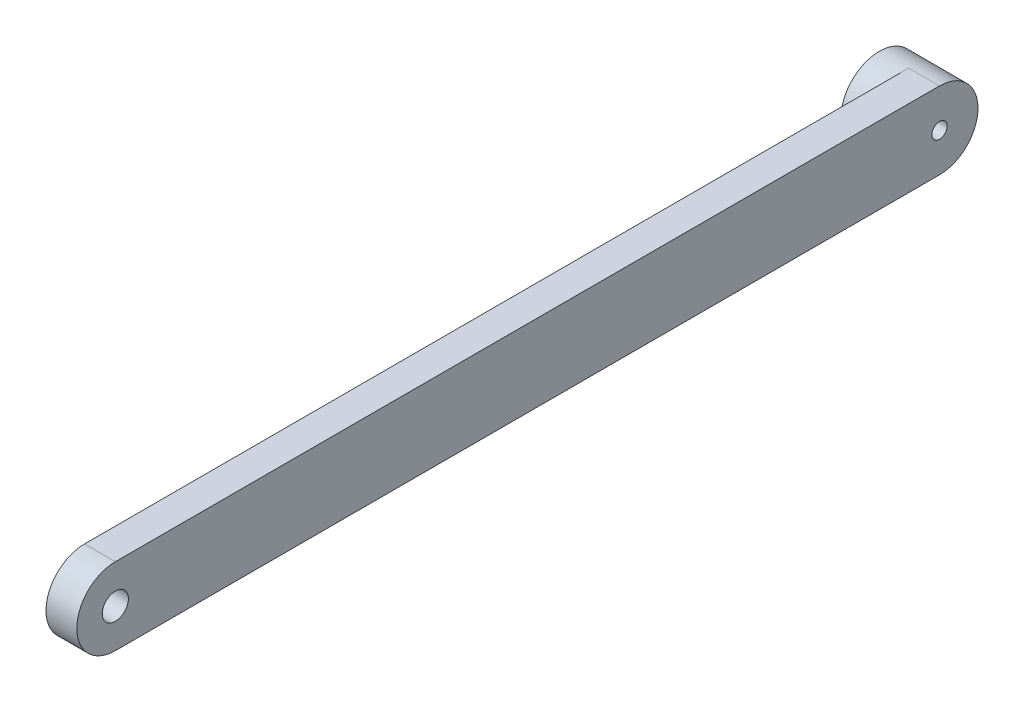
ISO-10303-21;
HEADER;
FILE_DESCRIPTION(('STEP AP214'),'2;1');
FILE_NAME('part.step','',(''),(''),'','','');
FILE_SCHEMA(('AUTOMOTIVE_DESIGN { 1 0 10303 214 1 1 1 1 }'));
ENDSEC;
DATA;
#1=APPLICATION_CONTEXT('core data for automotive mechanical design processes');
#2=APPLICATION_PROTOCOL_DEFINITION('international standard','automotive_design',2000,#1);
#3=PRODUCT_CONTEXT('',#1,'mechanical');
#4=PRODUCT('Part','Part','',(#3));
#5=PRODUCT_RELATED_PRODUCT_CATEGORY('part','',(#4));
#6=PRODUCT_DEFINITION_FORMATION('','',#4);
#7=PRODUCT_DEFINITION_CONTEXT('part definition',#1,'design');
#8=PRODUCT_DEFINITION('design','',#6,#7);
#9=PRODUCT_DEFINITION_SHAPE('','',#8);
#10=(LENGTH_UNIT() NAMED_UNIT(*) SI_UNIT(.MILLI.,.METRE.));
#11=(NAMED_UNIT(*) PLANE_ANGLE_UNIT() SI_UNIT($,.RADIAN.));
#12=(NAMED_UNIT(*) SI_UNIT($,.STERADIAN.) SOLID_ANGLE_UNIT());
#13=UNCERTAINTY_MEASURE_WITH_UNIT(LENGTH_MEASURE(1.E-05),#10,'distance_accuracy_value','');
#14=(GEOMETRIC_REPRESENTATION_CONTEXT(3) GLOBAL_UNCERTAINTY_ASSIGNED_CONTEXT((#13)) GLOBAL_UNIT_ASSIGNED_CONTEXT((#10,
#11,#12)) REPRESENTATION_CONTEXT('',''));
#15=CARTESIAN_POINT('',(0.,0.,0.));
#16=DIRECTION('',(0.,0.,1.));
#17=DIRECTION('',(1.,0.,0.));
#18=AXIS2_PLACEMENT_3D('',#15,#16,#17);
#19=CARTESIAN_POINT('',(2.,0.,0.));
#20=DIRECTION('',(-1.,0.,0.));
#21=DIRECTION('',(0.,0.,1.));
#22=AXIS2_PLACEMENT_3D('',#19,#20,#21);
#23=CYLINDRICAL_SURFACE('',#22,2.5);
#24=CARTESIAN_POINT('',(0.,0.,0.));
#25=DIRECTION('',(1.,0.,0.));
#26=DIRECTION('',(0.,0.,-1.));
#27=AXIS2_PLACEMENT_3D('',#24,#25,#26);
#28=CIRCLE('',#27,2.5);
#29=CARTESIAN_POINT('',(0.,2.5,0.));
#30=VERTEX_POINT('',#29);
#31=CARTESIAN_POINT('',(0.,-2.5,0.));
#32=VERTEX_POINT('',#31);
#33=EDGE_CURVE('E81',#30,#32,#28,.T.);
#34=ORIENTED_EDGE('',*,*,#33,.T.);
#35=DIRECTION('',(-1.,0.,0.));
#36=VECTOR('',#35,1.);
#37=CARTESIAN_POINT('',(2.,-2.5,0.));
#38=LINE('',#37,#36);
#39=CARTESIAN_POINT('',(2.,-2.5,0.));
#40=VERTEX_POINT('',#39);
#41=EDGE_CURVE('E35',#40,#32,#38,.T.);
#42=ORIENTED_EDGE('',*,*,#41,.F.);
#43=CARTESIAN_POINT('',(2.,0.,0.));
#44=DIRECTION('',(1.,0.,0.));
#45=DIRECTION('',(0.,0.,-1.));
#46=AXIS2_PLACEMENT_3D('',#43,#44,#45);
#47=CIRCLE('',#46,2.5);
#48=CARTESIAN_POINT('',(2.,2.5,0.));
#49=VERTEX_POINT('',#48);
#50=EDGE_CURVE('E82',#49,#40,#47,.T.);
#51=ORIENTED_EDGE('',*,*,#50,.F.);
#52=DIRECTION('',(-1.,0.,0.));
#53=VECTOR('',#52,1.);
#54=CARTESIAN_POINT('',(2.,2.5,0.));
#55=LINE('',#54,#53);
#56=EDGE_CURVE('E91',#49,#30,#55,.T.);
#57=ORIENTED_EDGE('',*,*,#56,.T.);
#58=EDGE_LOOP('',(#34,#42,#51,#57));
#59=FACE_BOUND('',#58,.T.);
#60=ADVANCED_FACE('F32',(#59),#23,.T.);
#61=CARTESIAN_POINT('',(2.,-2.5,0.));
#62=DIRECTION('',(0.,1.,0.));
#63=DIRECTION('',(0.,0.,1.));
#64=AXIS2_PLACEMENT_3D('',#61,#62,#63);
#65=PLANE('',#64);
#66=DIRECTION('',(0.,0.,-1.));
#67=VECTOR('',#66,1.);
#68=CARTESIAN_POINT('',(0.,-2.5,0.));
#69=LINE('',#68,#67);
#70=CARTESIAN_POINT('',(0.,-2.5,-53.5));
#71=VERTEX_POINT('',#70);
#72=EDGE_CURVE('E83',#32,#71,#69,.T.);
#73=ORIENTED_EDGE('',*,*,#72,.T.);
#74=DIRECTION('',(-1.,0.,0.));
#75=VECTOR('',#74,1.);
#76=CARTESIAN_POINT('',(2.,-2.5,-53.5));
#77=LINE('',#76,#75);
#78=CARTESIAN_POINT('',(2.,-2.5,-53.5));
#79=VERTEX_POINT('',#78);
#80=EDGE_CURVE('E90',#79,#71,#77,.T.);
#81=ORIENTED_EDGE('',*,*,#80,.F.);
#82=DIRECTION('',(0.,0.,-1.));
#83=VECTOR('',#82,1.);
#84=CARTESIAN_POINT('',(2.,-2.5,0.));
#85=LINE('',#84,#83);
#86=EDGE_CURVE('E75',#40,#79,#85,.T.);
#87=ORIENTED_EDGE('',*,*,#86,.F.);
#88=ORIENTED_EDGE('',*,*,#41,.T.);
#89=EDGE_LOOP('',(#73,#81,#87,#88));
#90=FACE_BOUND('',#89,.T.);
#91=ADVANCED_FACE('F131',(#90),#65,.F.);
#92=CARTESIAN_POINT('',(2.,0.,-53.5));
#93=DIRECTION('',(-1.,0.,0.));
#94=DIRECTION('',(0.,0.,1.));
#95=AXIS2_PLACEMENT_3D('',#92,#93,#94);
#96=CYLINDRICAL_SURFACE('',#95,2.5);
#97=ORIENTED_EDGE('',*,*,#80,.T.);
#98=CARTESIAN_POINT('',(0.,0.,-53.5));
#99=DIRECTION('',(-1.,0.,0.));
#100=DIRECTION('',(0.,0.,1.));
#101=AXIS2_PLACEMENT_3D('',#98,#99,#100);
#102=CIRCLE('',#101,2.5);
#103=CARTESIAN_POINT('',(0.,2.5,-53.5));
#104=VERTEX_POINT('',#103);
#105=EDGE_CURVE('E11',#71,#104,#102,.T.);
#106=ORIENTED_EDGE('',*,*,#105,.T.);
#107=DIRECTION('',(-1.,0.,0.));
#108=VECTOR('',#107,1.);
#109=CARTESIAN_POINT('',(2.,2.5,-53.5));
#110=LINE('',#109,#108);
#111=CARTESIAN_POINT('',(2.,2.5,-53.5));
#112=VERTEX_POINT('',#111);
#113=EDGE_CURVE('E86',#112,#104,#110,.T.);
#114=ORIENTED_EDGE('',*,*,#113,.F.);
#115=CARTESIAN_POINT('',(2.,0.,-53.5));
#116=DIRECTION('',(1.,0.,0.));
#117=DIRECTION('',(0.,0.,-1.));
#118=AXIS2_PLACEMENT_3D('',#115,#116,#117);
#119=CIRCLE('',#118,2.5);
#120=EDGE_CURVE('E96',#79,#112,#119,.T.);
#121=ORIENTED_EDGE('',*,*,#120,.F.);
#122=EDGE_LOOP('',(#97,#106,#114,#121));
#123=FACE_BOUND('',#122,.T.);
#124=CARTESIAN_POINT('',(-1.9,0.,-53.5));
#125=DIRECTION('',(-1.,0.,0.));
#126=DIRECTION('',(0.,0.,1.));
#127=AXIS2_PLACEMENT_3D('',#124,#125,#126);
#128=CIRCLE('',#127,2.5);
#129=CARTESIAN_POINT('',(-1.9,0.,-51.));
#130=VERTEX_POINT('',#129);
#131=EDGE_CURVE('E110',#130,#130,#128,.T.);
#132=ORIENTED_EDGE('',*,*,#131,.F.);
#133=EDGE_LOOP('',(#132));
#134=FACE_BOUND('',#133,.T.);
#135=ADVANCED_FACE('F94',(#123,#134),#96,.T.);
#136=CARTESIAN_POINT('',(2.,2.5,0.));
#137=DIRECTION('',(0.,-1.,0.));
#138=DIRECTION('',(0.,0.,-1.));
#139=AXIS2_PLACEMENT_3D('',#136,#137,#138);
#140=PLANE('',#139);
#141=DIRECTION('',(0.,0.,1.));
#142=VECTOR('',#141,1.);
#143=CARTESIAN_POINT('',(0.,2.5,0.));
#144=LINE('',#143,#142);
#145=EDGE_CURVE('E67',#104,#30,#144,.T.);
#146=ORIENTED_EDGE('',*,*,#145,.T.);
#147=ORIENTED_EDGE('',*,*,#56,.F.);
#148=DIRECTION('',(0.,0.,1.));
#149=VECTOR('',#148,1.);
#150=CARTESIAN_POINT('',(2.,2.5,0.));
#151=LINE('',#150,#149);
#152=EDGE_CURVE('E49',#112,#49,#151,.T.);
#153=ORIENTED_EDGE('',*,*,#152,.F.);
#154=ORIENTED_EDGE('',*,*,#113,.T.);
#155=EDGE_LOOP('',(#146,#147,#153,#154));
#156=FACE_BOUND('',#155,.T.);
#157=ADVANCED_FACE('F87',(#156),#140,.F.);
#158=CARTESIAN_POINT('',(2.,0.,0.));
#159=DIRECTION('',(1.,0.,0.));
#160=DIRECTION('',(0.,0.,-1.));
#161=AXIS2_PLACEMENT_3D('',#158,#159,#160);
#162=PLANE('',#161);
#163=CARTESIAN_POINT('',(2.,0.,-53.5));
#164=DIRECTION('',(1.,0.,0.));
#165=DIRECTION('',(0.,0.,-1.));
#166=AXIS2_PLACEMENT_3D('',#163,#164,#165);
#167=CIRCLE('',#166,0.499999999999999);
#168=CARTESIAN_POINT('',(2.,0.,-54.));
#169=VERTEX_POINT('',#168);
#170=EDGE_CURVE('E114',#169,#169,#167,.T.);
#171=ORIENTED_EDGE('',*,*,#170,.F.);
#172=EDGE_LOOP('',(#171));
#173=FACE_BOUND('',#172,.T.);
#174=CARTESIAN_POINT('',(2.,0.,0.));
#175=DIRECTION('',(1.,0.,0.));
#176=DIRECTION('',(0.,0.,-1.));
#177=AXIS2_PLACEMENT_3D('',#174,#175,#176);
#178=CIRCLE('',#177,0.85);
#179=CARTESIAN_POINT('',(2.,0.,-0.85));
#180=VERTEX_POINT('',#179);
#181=EDGE_CURVE('E108',#180,#180,#178,.T.);
#182=ORIENTED_EDGE('',*,*,#181,.F.);
#183=EDGE_LOOP('',(#182));
#184=FACE_BOUND('',#183,.T.);
#185=ORIENTED_EDGE('',*,*,#50,.T.);
#186=ORIENTED_EDGE('',*,*,#86,.T.);
#187=ORIENTED_EDGE('',*,*,#120,.T.);
#188=ORIENTED_EDGE('',*,*,#152,.T.);
#189=EDGE_LOOP('',(#185,#186,#187,#188));
#190=FACE_BOUND('',#189,.T.);
#191=ADVANCED_FACE('F123',(#173,#184,#190),#162,.T.);
#192=CARTESIAN_POINT('',(0.,0.,0.));
#193=DIRECTION('',(1.,0.,0.));
#194=DIRECTION('',(0.,0.,-1.));
#195=AXIS2_PLACEMENT_3D('',#192,#193,#194);
#196=PLANE('',#195);
#197=ORIENTED_EDGE('',*,*,#105,.F.);
#198=ORIENTED_EDGE('',*,*,#72,.F.);
#199=ORIENTED_EDGE('',*,*,#33,.F.);
#200=ORIENTED_EDGE('',*,*,#145,.F.);
#201=EDGE_LOOP('',(#197,#198,#199,#200));
#202=FACE_BOUND('',#201,.T.);
#203=CARTESIAN_POINT('',(0.,0.,0.));
#204=DIRECTION('',(1.,0.,0.));
#205=DIRECTION('',(0.,0.,-1.));
#206=AXIS2_PLACEMENT_3D('',#203,#204,#205);
#207=CIRCLE('',#206,0.85);
#208=CARTESIAN_POINT('',(0.,0.,-0.85));
#209=VERTEX_POINT('',#208);
#210=EDGE_CURVE('E101',#209,#209,#207,.F.);
#211=ORIENTED_EDGE('',*,*,#210,.F.);
#212=EDGE_LOOP('',(#211));
#213=FACE_BOUND('',#212,.T.);
#214=ADVANCED_FACE('F78',(#202,#213),#196,.F.);
#215=CARTESIAN_POINT('',(-0.00100000000000013,0.,0.));
#216=DIRECTION('',(1.,0.,0.));
#217=DIRECTION('',(0.,0.,-1.));
#218=AXIS2_PLACEMENT_3D('',#215,#216,#217);
#219=CYLINDRICAL_SURFACE('',#218,0.85);
#220=ORIENTED_EDGE('',*,*,#181,.T.);
#221=EDGE_LOOP('',(#220));
#222=FACE_BOUND('',#221,.T.);
#223=ORIENTED_EDGE('',*,*,#210,.T.);
#224=EDGE_LOOP('',(#223));
#225=FACE_BOUND('',#224,.T.);
#226=ADVANCED_FACE('F142',(#222,#225),#219,.F.);
#227=CARTESIAN_POINT('',(-1.9,0.,-53.5));
#228=DIRECTION('',(-1.,0.,0.));
#229=DIRECTION('',(0.,0.,1.));
#230=AXIS2_PLACEMENT_3D('',#227,#228,#229);
#231=PLANE('',#230);
#232=CARTESIAN_POINT('',(-1.9,0.,-53.5));
#233=DIRECTION('',(-1.,0.,0.));
#234=DIRECTION('',(0.,0.,1.));
#235=AXIS2_PLACEMENT_3D('',#232,#233,#234);
#236=CIRCLE('',#235,0.499999999999999);
#237=CARTESIAN_POINT('',(-1.9,0.,-53.));
#238=VERTEX_POINT('',#237);
#239=EDGE_CURVE('E115',#238,#238,#236,.F.);
#240=ORIENTED_EDGE('',*,*,#239,.T.);
#241=EDGE_LOOP('',(#240));
#242=FACE_BOUND('',#241,.T.);
#243=ORIENTED_EDGE('',*,*,#131,.T.);
#244=EDGE_LOOP('',(#243));
#245=FACE_BOUND('',#244,.T.);
#246=ADVANCED_FACE('F146',(#242,#245),#231,.T.);
#247=CARTESIAN_POINT('',(-1.901,0.,-53.5));
#248=DIRECTION('',(1.,0.,0.));
#249=DIRECTION('',(0.,0.,-1.));
#250=AXIS2_PLACEMENT_3D('',#247,#248,#249);
#251=CYLINDRICAL_SURFACE('',#250,0.499999999999999);
#252=ORIENTED_EDGE('',*,*,#239,.F.);
#253=EDGE_LOOP('',(#252));
#254=FACE_BOUND('',#253,.T.);
#255=ORIENTED_EDGE('',*,*,#170,.T.);
#256=EDGE_LOOP('',(#255));
#257=FACE_BOUND('',#256,.T.);
#258=ADVANCED_FACE('F121',(#254,#257),#251,.F.);
#259=CLOSED_SHELL('',(#60,#91,#135,#157,#191,#214,#226,#246,#258));
#260=MANIFOLD_SOLID_BREP('B2',#259);
#261=ADVANCED_BREP_SHAPE_REPRESENTATION('',(#18,#260),#14);
#262=SHAPE_DEFINITION_REPRESENTATION(#9,#261);
ENDSEC;
END-ISO-10303-21;
